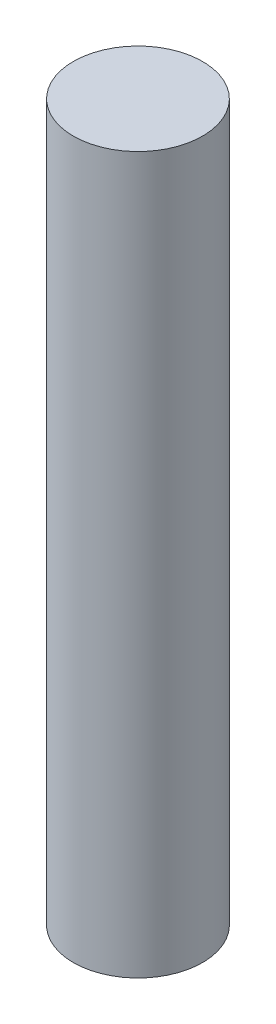
ISO-10303-21;
HEADER;
FILE_DESCRIPTION(('STEP AP214'),'2;1');
FILE_NAME('part.step','',(''),(''),'','','');
FILE_SCHEMA(('AUTOMOTIVE_DESIGN { 1 0 10303 214 1 1 1 1 }'));
ENDSEC;
DATA;
#1=APPLICATION_CONTEXT('core data for automotive mechanical design processes');
#2=APPLICATION_PROTOCOL_DEFINITION('international standard','automotive_design',2000,#1);
#3=PRODUCT_CONTEXT('',#1,'mechanical');
#4=PRODUCT('Part','Part','',(#3));
#5=PRODUCT_RELATED_PRODUCT_CATEGORY('part','',(#4));
#6=PRODUCT_DEFINITION_FORMATION('','',#4);
#7=PRODUCT_DEFINITION_CONTEXT('part definition',#1,'design');
#8=PRODUCT_DEFINITION('design','',#6,#7);
#9=PRODUCT_DEFINITION_SHAPE('','',#8);
#10=(LENGTH_UNIT() NAMED_UNIT(*) SI_UNIT(.MILLI.,.METRE.));
#11=(NAMED_UNIT(*) PLANE_ANGLE_UNIT() SI_UNIT($,.RADIAN.));
#12=(NAMED_UNIT(*) SI_UNIT($,.STERADIAN.) SOLID_ANGLE_UNIT());
#13=UNCERTAINTY_MEASURE_WITH_UNIT(LENGTH_MEASURE(1.E-05),#10,'distance_accuracy_value','');
#14=(GEOMETRIC_REPRESENTATION_CONTEXT(3) GLOBAL_UNCERTAINTY_ASSIGNED_CONTEXT((#13)) GLOBAL_UNIT_ASSIGNED_CONTEXT((#10,
#11,#12)) REPRESENTATION_CONTEXT('',''));
#15=CARTESIAN_POINT('',(0.,0.,0.));
#16=DIRECTION('',(0.,0.,1.));
#17=DIRECTION('',(1.,0.,0.));
#18=AXIS2_PLACEMENT_3D('',#15,#16,#17);
#19=CARTESIAN_POINT('',(0.,15.5,0.));
#20=DIRECTION('',(0.,-1.,0.));
#21=DIRECTION('',(0.,0.,-1.));
#22=AXIS2_PLACEMENT_3D('',#19,#20,#21);
#23=CYLINDRICAL_SURFACE('',#22,1.4);
#24=CARTESIAN_POINT('',(0.,15.5,0.));
#25=DIRECTION('',(0.,1.,0.));
#26=DIRECTION('',(0.,0.,1.));
#27=AXIS2_PLACEMENT_3D('',#24,#25,#26);
#28=CIRCLE('',#27,1.4);
#29=CARTESIAN_POINT('',(0.,15.5,1.4));
#30=VERTEX_POINT('',#29);
#31=EDGE_CURVE('E10',#30,#30,#28,.T.);
#32=ORIENTED_EDGE('',*,*,#31,.F.);
#33=EDGE_LOOP('',(#32));
#34=FACE_BOUND('',#33,.T.);
#35=CARTESIAN_POINT('',(0.,0.,0.));
#36=DIRECTION('',(0.,1.,0.));
#37=DIRECTION('',(0.,0.,1.));
#38=AXIS2_PLACEMENT_3D('',#35,#36,#37);
#39=CIRCLE('',#38,1.4);
#40=CARTESIAN_POINT('',(0.,0.,1.4));
#41=VERTEX_POINT('',#40);
#42=EDGE_CURVE('E36',#41,#41,#39,.T.);
#43=ORIENTED_EDGE('',*,*,#42,.T.);
#44=EDGE_LOOP('',(#43));
#45=FACE_BOUND('',#44,.T.);
#46=ADVANCED_FACE('F33',(#34,#45),#23,.T.);
#47=CARTESIAN_POINT('',(0.,15.5,0.));
#48=DIRECTION('',(0.,1.,0.));
#49=DIRECTION('',(0.,0.,1.));
#50=AXIS2_PLACEMENT_3D('',#47,#48,#49);
#51=PLANE('',#50);
#52=ORIENTED_EDGE('',*,*,#31,.T.);
#53=EDGE_LOOP('',(#52));
#54=FACE_BOUND('',#53,.T.);
#55=ADVANCED_FACE('F48',(#54),#51,.T.);
#56=CARTESIAN_POINT('',(0.,0.,0.));
#57=DIRECTION('',(0.,1.,0.));
#58=DIRECTION('',(0.,0.,1.));
#59=AXIS2_PLACEMENT_3D('',#56,#57,#58);
#60=PLANE('',#59);
#61=ORIENTED_EDGE('',*,*,#42,.F.);
#62=EDGE_LOOP('',(#61));
#63=FACE_BOUND('',#62,.T.);
#64=ADVANCED_FACE('F46',(#63),#60,.F.);
#65=CLOSED_SHELL('',(#46,#55,#64));
#66=MANIFOLD_SOLID_BREP('B2',#65);
#67=ADVANCED_BREP_SHAPE_REPRESENTATION('',(#18,#66),#14);
#68=SHAPE_DEFINITION_REPRESENTATION(#9,#67);
ENDSEC;
END-ISO-10303-21;
